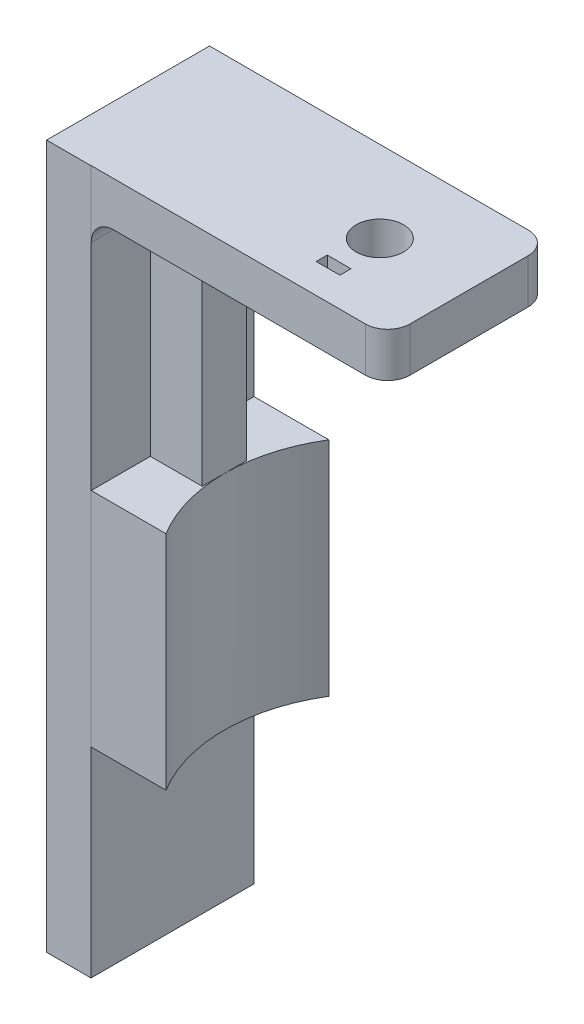
ISO-10303-21;
HEADER;
FILE_DESCRIPTION(('STEP AP214'),'2;1');
FILE_NAME('part.step','',(''),(''),'','','');
FILE_SCHEMA(('AUTOMOTIVE_DESIGN { 1 0 10303 214 1 1 1 1 }'));
ENDSEC;
DATA;
#1=APPLICATION_CONTEXT('core data for automotive mechanical design processes');
#2=APPLICATION_PROTOCOL_DEFINITION('international standard','automotive_design',2000,#1);
#3=PRODUCT_CONTEXT('',#1,'mechanical');
#4=PRODUCT('Part','Part','',(#3));
#5=PRODUCT_RELATED_PRODUCT_CATEGORY('part','',(#4));
#6=PRODUCT_DEFINITION_FORMATION('','',#4);
#7=PRODUCT_DEFINITION_CONTEXT('part definition',#1,'design');
#8=PRODUCT_DEFINITION('design','',#6,#7);
#9=PRODUCT_DEFINITION_SHAPE('','',#8);
#10=(LENGTH_UNIT() NAMED_UNIT(*) SI_UNIT(.MILLI.,.METRE.));
#11=(NAMED_UNIT(*) PLANE_ANGLE_UNIT() SI_UNIT($,.RADIAN.));
#12=(NAMED_UNIT(*) SI_UNIT($,.STERADIAN.) SOLID_ANGLE_UNIT());
#13=UNCERTAINTY_MEASURE_WITH_UNIT(LENGTH_MEASURE(1.E-05),#10,'distance_accuracy_value','');
#14=(GEOMETRIC_REPRESENTATION_CONTEXT(3) GLOBAL_UNCERTAINTY_ASSIGNED_CONTEXT((#13)) GLOBAL_UNIT_ASSIGNED_CONTEXT((#10,
#11,#12)) REPRESENTATION_CONTEXT('',''));
#15=CARTESIAN_POINT('',(0.,0.,0.));
#16=DIRECTION('',(0.,0.,1.));
#17=DIRECTION('',(1.,0.,0.));
#18=AXIS2_PLACEMENT_3D('',#15,#16,#17);
#19=CARTESIAN_POINT('',(-28.,95.,0.));
#20=DIRECTION('',(1.,0.,0.));
#21=DIRECTION('',(0.,0.,-1.));
#22=AXIS2_PLACEMENT_3D('',#19,#20,#21);
#23=PLANE('',#22);
#24=DIRECTION('',(0.,-1.,0.));
#25=VECTOR('',#24,1.);
#26=CARTESIAN_POINT('',(-28.,95.,-11.));
#27=LINE('',#26,#25);
#28=CARTESIAN_POINT('',(-28.,86.,-11.));
#29=VERTEX_POINT('',#28);
#30=CARTESIAN_POINT('',(-28.,57.,-11.));
#31=VERTEX_POINT('',#30);
#32=EDGE_CURVE('E224',#29,#31,#27,.T.);
#33=ORIENTED_EDGE('',*,*,#32,.F.);
#34=DIRECTION('',(0.,0.,1.));
#35=VECTOR('',#34,1.);
#36=CARTESIAN_POINT('',(-28.,86.,-3.01081498479428));
#37=LINE('',#36,#35);
#38=CARTESIAN_POINT('',(-28.,86.,-3.01081498479427));
#39=VERTEX_POINT('',#38);
#40=EDGE_CURVE('E384',#29,#39,#37,.T.);
#41=ORIENTED_EDGE('',*,*,#40,.T.);
#42=DIRECTION('',(0.,1.,0.));
#43=VECTOR('',#42,1.);
#44=CARTESIAN_POINT('',(-28.,89.,-3.01081498479427));
#45=LINE('',#44,#43);
#46=CARTESIAN_POINT('',(-28.,57.,-3.01081498479427));
#47=VERTEX_POINT('',#46);
#48=EDGE_CURVE('E253',#47,#39,#45,.T.);
#49=ORIENTED_EDGE('',*,*,#48,.F.);
#50=DIRECTION('',(0.,0.,-1.));
#51=VECTOR('',#50,1.);
#52=CARTESIAN_POINT('',(-28.,57.,10.9783700304121));
#53=LINE('',#52,#51);
#54=EDGE_CURVE('E229',#47,#31,#53,.T.);
#55=ORIENTED_EDGE('',*,*,#54,.T.);
#56=EDGE_LOOP('',(#33,#41,#49,#55));
#57=FACE_BOUND('',#56,.T.);
#58=ADVANCED_FACE('F35',(#57),#23,.T.);
#59=DIRECTION('',(0.,-1.,0.));
#60=VECTOR('',#59,1.);
#61=CARTESIAN_POINT('',(-28.,89.,2.98918501520605));
#62=LINE('',#61,#60);
#63=CARTESIAN_POINT('',(-28.,86.,2.98918501520605));
#64=VERTEX_POINT('',#63);
#65=CARTESIAN_POINT('',(-28.,57.,2.98918501520605));
#66=VERTEX_POINT('',#65);
#67=EDGE_CURVE('E249',#64,#66,#62,.T.);
#68=ORIENTED_EDGE('',*,*,#67,.F.);
#69=DIRECTION('',(0.,0.,1.));
#70=VECTOR('',#69,1.);
#71=CARTESIAN_POINT('',(-28.,86.,10.9783700304121));
#72=LINE('',#71,#70);
#73=CARTESIAN_POINT('',(-28.,86.,10.9783700304121));
#74=VERTEX_POINT('',#73);
#75=EDGE_CURVE('E372',#64,#74,#72,.T.);
#76=ORIENTED_EDGE('',*,*,#75,.T.);
#77=DIRECTION('',(0.,1.,0.));
#78=VECTOR('',#77,1.);
#79=CARTESIAN_POINT('',(-28.,89.,10.9783700304121));
#80=LINE('',#79,#78);
#81=CARTESIAN_POINT('',(-28.,95.,10.9783700304121));
#82=VERTEX_POINT('',#81);
#83=EDGE_CURVE('E319',#74,#82,#80,.T.);
#84=ORIENTED_EDGE('',*,*,#83,.T.);
#85=DIRECTION('',(0.,0.,1.));
#86=VECTOR('',#85,1.);
#87=CARTESIAN_POINT('',(-28.,95.,0.));
#88=LINE('',#87,#86);
#89=CARTESIAN_POINT('',(-28.,95.,11.));
#90=VERTEX_POINT('',#89);
#91=EDGE_CURVE('E342',#82,#90,#88,.T.);
#92=ORIENTED_EDGE('',*,*,#91,.T.);
#93=DIRECTION('',(0.,-1.,0.));
#94=VECTOR('',#93,1.);
#95=CARTESIAN_POINT('',(-28.,95.,11.));
#96=LINE('',#95,#94);
#97=CARTESIAN_POINT('',(-28.,0.,11.));
#98=VERTEX_POINT('',#97);
#99=EDGE_CURVE('E352',#90,#98,#96,.T.);
#100=ORIENTED_EDGE('',*,*,#99,.T.);
#101=DIRECTION('',(0.,0.,1.));
#102=VECTOR('',#101,1.);
#103=CARTESIAN_POINT('',(-28.,0.,0.));
#104=LINE('',#103,#102);
#105=CARTESIAN_POINT('',(-28.,0.,-11.));
#106=VERTEX_POINT('',#105);
#107=EDGE_CURVE('E333',#106,#98,#104,.T.);
#108=ORIENTED_EDGE('',*,*,#107,.F.);
#109=CARTESIAN_POINT('',(-28.,27.,-11.));
#110=VERTEX_POINT('',#109);
#111=EDGE_CURVE('E368',#110,#106,#27,.T.);
#112=ORIENTED_EDGE('',*,*,#111,.F.);
#113=DIRECTION('',(0.,0.,-1.));
#114=VECTOR('',#113,1.);
#115=CARTESIAN_POINT('',(-28.,27.,2.98918501520605));
#116=LINE('',#115,#114);
#117=CARTESIAN_POINT('',(-28.,27.,10.9783700304121));
#118=VERTEX_POINT('',#117);
#119=EDGE_CURVE('E257',#118,#110,#116,.T.);
#120=ORIENTED_EDGE('',*,*,#119,.F.);
#121=DIRECTION('',(0.,-1.,0.));
#122=VECTOR('',#121,1.);
#123=CARTESIAN_POINT('',(-28.,57.,10.9783700304121));
#124=LINE('',#123,#122);
#125=CARTESIAN_POINT('',(-28.,57.,10.9783700304121));
#126=VERTEX_POINT('',#125);
#127=EDGE_CURVE('E240',#126,#118,#124,.T.);
#128=ORIENTED_EDGE('',*,*,#127,.F.);
#129=EDGE_CURVE('E226',#126,#66,#53,.T.);
#130=ORIENTED_EDGE('',*,*,#129,.T.);
#131=EDGE_LOOP('',(#68,#76,#84,#92,#100,#108,#112,#120,#128,#130));
#132=FACE_BOUND('',#131,.T.);
#133=ADVANCED_FACE('F415',(#132),#23,.T.);
#134=CARTESIAN_POINT('',(-21.,89.,2.98918501520605));
#135=DIRECTION('',(0.,0.,-1.));
#136=DIRECTION('',(-1.,0.,0.));
#137=AXIS2_PLACEMENT_3D('',#134,#135,#136);
#138=PLANE('',#137);
#139=DIRECTION('',(-1.,0.,0.));
#140=VECTOR('',#139,1.);
#141=CARTESIAN_POINT('',(-21.,89.,2.98918501520605));
#142=LINE('',#141,#140);
#143=CARTESIAN_POINT('',(-18.,89.,2.98918501520605));
#144=VERTEX_POINT('',#143);
#145=CARTESIAN_POINT('',(-25.,89.,2.98918501520605));
#146=VERTEX_POINT('',#145);
#147=EDGE_CURVE('E255',#144,#146,#142,.T.);
#148=ORIENTED_EDGE('',*,*,#147,.T.);
#149=CARTESIAN_POINT('',(-25.,86.,2.98918501520605));
#150=DIRECTION('',(0.,0.,-1.));
#151=DIRECTION('',(-1.,0.,0.));
#152=AXIS2_PLACEMENT_3D('',#149,#150,#151);
#153=CIRCLE('',#152,3.);
#154=EDGE_CURVE('E382',#146,#64,#153,.F.);
#155=ORIENTED_EDGE('',*,*,#154,.T.);
#156=ORIENTED_EDGE('',*,*,#67,.T.);
#157=DIRECTION('',(-1.,0.,0.));
#158=VECTOR('',#157,1.);
#159=CARTESIAN_POINT('',(-21.,57.,2.98918501520605));
#160=LINE('',#159,#158);
#161=CARTESIAN_POINT('',(-21.,57.,2.98918501520605));
#162=VERTEX_POINT('',#161);
#163=EDGE_CURVE('E246',#162,#66,#160,.T.);
#164=ORIENTED_EDGE('',*,*,#163,.F.);
#165=DIRECTION('',(0.,-1.,0.));
#166=VECTOR('',#165,1.);
#167=CARTESIAN_POINT('',(-21.,89.,2.98918501520605));
#168=LINE('',#167,#166);
#169=CARTESIAN_POINT('',(-21.,86.,2.98918501520605));
#170=VERTEX_POINT('',#169);
#171=EDGE_CURVE('E250',#170,#162,#168,.T.);
#172=ORIENTED_EDGE('',*,*,#171,.F.);
#173=CARTESIAN_POINT('',(-18.,86.,2.98918501520605));
#174=DIRECTION('',(0.,0.,-1.));
#175=DIRECTION('',(-1.,0.,0.));
#176=AXIS2_PLACEMENT_3D('',#173,#174,#175);
#177=CIRCLE('',#176,3.);
#178=EDGE_CURVE('E43',#170,#144,#177,.T.);
#179=ORIENTED_EDGE('',*,*,#178,.T.);
#180=EDGE_LOOP('',(#148,#155,#156,#164,#172,#179));
#181=FACE_BOUND('',#180,.T.);
#182=ADVANCED_FACE('F398',(#181),#138,.F.);
#183=CARTESIAN_POINT('',(-21.,89.,-3.01081498479427));
#184=DIRECTION('',(0.,0.,1.));
#185=DIRECTION('',(1.,0.,0.));
#186=AXIS2_PLACEMENT_3D('',#183,#184,#185);
#187=PLANE('',#186);
#188=ORIENTED_EDGE('',*,*,#48,.T.);
#189=CARTESIAN_POINT('',(-25.,86.,-3.01081498479427));
#190=DIRECTION('',(0.,0.,1.));
#191=DIRECTION('',(1.,0.,0.));
#192=AXIS2_PLACEMENT_3D('',#189,#190,#191);
#193=CIRCLE('',#192,3.);
#194=CARTESIAN_POINT('',(-25.,89.,-3.01081498479427));
#195=VERTEX_POINT('',#194);
#196=EDGE_CURVE('E387',#39,#195,#193,.F.);
#197=ORIENTED_EDGE('',*,*,#196,.T.);
#198=DIRECTION('',(-1.,0.,0.));
#199=VECTOR('',#198,1.);
#200=CARTESIAN_POINT('',(-21.,89.,-3.01081498479427));
#201=LINE('',#200,#199);
#202=CARTESIAN_POINT('',(-18.,89.,-3.01081498479427));
#203=VERTEX_POINT('',#202);
#204=EDGE_CURVE('E263',#203,#195,#201,.T.);
#205=ORIENTED_EDGE('',*,*,#204,.F.);
#206=CARTESIAN_POINT('',(-18.,86.,-3.01081498479427));
#207=DIRECTION('',(0.,0.,1.));
#208=DIRECTION('',(1.,0.,0.));
#209=AXIS2_PLACEMENT_3D('',#206,#207,#208);
#210=CIRCLE('',#209,3.);
#211=CARTESIAN_POINT('',(-21.,86.,-3.01081498479427));
#212=VERTEX_POINT('',#211);
#213=EDGE_CURVE('E11',#203,#212,#210,.T.);
#214=ORIENTED_EDGE('',*,*,#213,.T.);
#215=DIRECTION('',(0.,1.,0.));
#216=VECTOR('',#215,1.);
#217=CARTESIAN_POINT('',(-21.,89.,-3.01081498479427));
#218=LINE('',#217,#216);
#219=CARTESIAN_POINT('',(-21.,57.,-3.01081498479427));
#220=VERTEX_POINT('',#219);
#221=EDGE_CURVE('E252',#220,#212,#218,.T.);
#222=ORIENTED_EDGE('',*,*,#221,.F.);
#223=DIRECTION('',(1.,0.,0.));
#224=VECTOR('',#223,1.);
#225=CARTESIAN_POINT('',(-21.,57.,-3.01081498479427));
#226=LINE('',#225,#224);
#227=EDGE_CURVE('E243',#47,#220,#226,.T.);
#228=ORIENTED_EDGE('',*,*,#227,.F.);
#229=EDGE_LOOP('',(#188,#197,#205,#214,#222,#228));
#230=FACE_BOUND('',#229,.T.);
#231=ADVANCED_FACE('F423',(#230),#187,.F.);
#232=CARTESIAN_POINT('',(-21.,0.,0.));
#233=DIRECTION('',(1.,0.,0.));
#234=DIRECTION('',(0.,0.,-1.));
#235=AXIS2_PLACEMENT_3D('',#232,#233,#234);
#236=PLANE('',#235);
#237=ORIENTED_EDGE('',*,*,#221,.T.);
#238=DIRECTION('',(0.,0.,1.));
#239=VECTOR('',#238,1.);
#240=CARTESIAN_POINT('',(-21.,86.,2.98918501520605));
#241=LINE('',#240,#239);
#242=EDGE_CURVE('E389',#212,#170,#241,.T.);
#243=ORIENTED_EDGE('',*,*,#242,.T.);
#244=ORIENTED_EDGE('',*,*,#171,.T.);
#245=DIRECTION('',(0.,0.,-1.));
#246=VECTOR('',#245,1.);
#247=CARTESIAN_POINT('',(-21.,57.,0.));
#248=LINE('',#247,#246);
#249=CARTESIAN_POINT('',(-21.,57.,0.));
#250=VERTEX_POINT('',#249);
#251=EDGE_CURVE('E371',#162,#250,#248,.T.);
#252=ORIENTED_EDGE('',*,*,#251,.T.);
#253=EDGE_CURVE('E218',#250,#220,#248,.T.);
#254=ORIENTED_EDGE('',*,*,#253,.T.);
#255=EDGE_LOOP('',(#237,#243,#244,#252,#254));
#256=FACE_BOUND('',#255,.T.);
#257=ADVANCED_FACE('F422',(#256),#236,.T.);
#258=CARTESIAN_POINT('',(9.04131752396575,89.,7.97837003041212));
#259=DIRECTION('',(0.,-1.,0.));
#260=DIRECTION('',(0.,0.,-1.));
#261=AXIS2_PLACEMENT_3D('',#258,#259,#260);
#262=PLANE('',#261);
#263=DIRECTION('',(0.,0.,1.));
#264=VECTOR('',#263,1.);
#265=CARTESIAN_POINT('',(-1.6,89.,5.5));
#266=LINE('',#265,#264);
#267=CARTESIAN_POINT('',(-1.6,89.,5.5));
#268=VERTEX_POINT('',#267);
#269=CARTESIAN_POINT('',(-1.6,89.,7.));
#270=VERTEX_POINT('',#269);
#271=EDGE_CURVE('E267',#268,#270,#266,.T.);
#272=ORIENTED_EDGE('',*,*,#271,.T.);
#273=DIRECTION('',(1.,0.,0.));
#274=VECTOR('',#273,1.);
#275=CARTESIAN_POINT('',(-1.6,89.,7.));
#276=LINE('',#275,#274);
#277=CARTESIAN_POINT('',(1.6,89.,7.));
#278=VERTEX_POINT('',#277);
#279=EDGE_CURVE('E270',#270,#278,#276,.T.);
#280=ORIENTED_EDGE('',*,*,#279,.T.);
#281=DIRECTION('',(0.,0.,-1.));
#282=VECTOR('',#281,1.);
#283=CARTESIAN_POINT('',(1.6,89.,5.5));
#284=LINE('',#283,#282);
#285=CARTESIAN_POINT('',(1.6,89.,5.5));
#286=VERTEX_POINT('',#285);
#287=EDGE_CURVE('E274',#278,#286,#284,.T.);
#288=ORIENTED_EDGE('',*,*,#287,.T.);
#289=DIRECTION('',(-1.,0.,0.));
#290=VECTOR('',#289,1.);
#291=CARTESIAN_POINT('',(-1.6,89.,5.5));
#292=LINE('',#291,#290);
#293=EDGE_CURVE('E277',#286,#268,#292,.T.);
#294=ORIENTED_EDGE('',*,*,#293,.T.);
#295=EDGE_LOOP('',(#272,#280,#288,#294));
#296=FACE_BOUND('',#295,.T.);
#297=CARTESIAN_POINT('',(0.,89.,0.));
#298=DIRECTION('',(0.,1.,0.));
#299=DIRECTION('',(0.,0.,1.));
#300=AXIS2_PLACEMENT_3D('',#297,#298,#299);
#301=CIRCLE('',#300,3.2);
#302=CARTESIAN_POINT('',(0.,89.,3.2));
#303=VERTEX_POINT('',#302);
#304=EDGE_CURVE('E299',#303,#303,#301,.T.);
#305=ORIENTED_EDGE('',*,*,#304,.T.);
#306=EDGE_LOOP('',(#305));
#307=FACE_BOUND('',#306,.T.);
#308=DIRECTION('',(1.,0.,0.));
#309=VECTOR('',#308,1.);
#310=CARTESIAN_POINT('',(-28.,89.,10.9783700304121));
#311=LINE('',#310,#309);
#312=CARTESIAN_POINT('',(-25.,89.,10.9783700304121));
#313=VERTEX_POINT('',#312);
#314=CARTESIAN_POINT('',(9.04131752396575,89.,10.9783700304121));
#315=VERTEX_POINT('',#314);
#316=EDGE_CURVE('E305',#313,#315,#311,.T.);
#317=ORIENTED_EDGE('',*,*,#316,.F.);
#318=DIRECTION('',(0.,0.,1.));
#319=VECTOR('',#318,1.);
#320=CARTESIAN_POINT('',(-25.,89.,2.98918501520605));
#321=LINE('',#320,#319);
#322=EDGE_CURVE('E380',#313,#146,#321,.F.);
#323=ORIENTED_EDGE('',*,*,#322,.T.);
#324=ORIENTED_EDGE('',*,*,#147,.F.);
#325=DIRECTION('',(0.,0.,1.));
#326=VECTOR('',#325,1.);
#327=CARTESIAN_POINT('',(-18.,89.,-3.01081498479428));
#328=LINE('',#327,#326);
#329=EDGE_CURVE('E375',#144,#203,#328,.F.);
#330=ORIENTED_EDGE('',*,*,#329,.T.);
#331=ORIENTED_EDGE('',*,*,#204,.T.);
#332=DIRECTION('',(0.,0.,1.));
#333=VECTOR('',#332,1.);
#334=CARTESIAN_POINT('',(-25.,89.,-11.));
#335=LINE('',#334,#333);
#336=CARTESIAN_POINT('',(-25.,89.,-11.));
#337=VERTEX_POINT('',#336);
#338=EDGE_CURVE('E378',#195,#337,#335,.F.);
#339=ORIENTED_EDGE('',*,*,#338,.T.);
#340=DIRECTION('',(-1.,0.,0.));
#341=VECTOR('',#340,1.);
#342=CARTESIAN_POINT('',(-28.,89.,-11.));
#343=LINE('',#342,#341);
#344=CARTESIAN_POINT('',(9.04131752396575,89.,-11.));
#345=VERTEX_POINT('',#344);
#346=EDGE_CURVE('E317',#345,#337,#343,.T.);
#347=ORIENTED_EDGE('',*,*,#346,.F.);
#348=CARTESIAN_POINT('',(9.04131752396575,89.,-8.));
#349=DIRECTION('',(0.,1.,0.));
#350=DIRECTION('',(0.,0.,1.));
#351=AXIS2_PLACEMENT_3D('',#348,#349,#350);
#352=CIRCLE('',#351,3.);
#353=CARTESIAN_POINT('',(12.0413175239657,89.,-8.));
#354=VERTEX_POINT('',#353);
#355=EDGE_CURVE('E314',#354,#345,#352,.T.);
#356=ORIENTED_EDGE('',*,*,#355,.F.);
#357=DIRECTION('',(0.,0.,-1.));
#358=VECTOR('',#357,1.);
#359=CARTESIAN_POINT('',(12.0413175239657,89.,-8.));
#360=LINE('',#359,#358);
#361=CARTESIAN_POINT('',(12.0413175239657,89.,7.97837003041212));
#362=VERTEX_POINT('',#361);
#363=EDGE_CURVE('E311',#362,#354,#360,.T.);
#364=ORIENTED_EDGE('',*,*,#363,.F.);
#365=CARTESIAN_POINT('',(9.04131752396575,89.,7.97837003041212));
#366=DIRECTION('',(0.,1.,0.));
#367=DIRECTION('',(0.,0.,-1.));
#368=AXIS2_PLACEMENT_3D('',#365,#366,#367);
#369=CIRCLE('',#368,3.);
#370=EDGE_CURVE('E307',#315,#362,#369,.T.);
#371=ORIENTED_EDGE('',*,*,#370,.F.);
#372=EDGE_LOOP('',(#317,#323,#324,#330,#331,#339,#347,#356,#364,#371));
#373=FACE_BOUND('',#372,.T.);
#374=ADVANCED_FACE('F405',(#296,#307,#373),#262,.T.);
#375=CARTESIAN_POINT('',(0.,95.,-11.));
#376=DIRECTION('',(0.,0.,-1.));
#377=DIRECTION('',(-1.,0.,0.));
#378=AXIS2_PLACEMENT_3D('',#375,#376,#377);
#379=PLANE('',#378);
#380=DIRECTION('',(1.,0.,0.));
#381=VECTOR('',#380,1.);
#382=CARTESIAN_POINT('',(0.,0.,-11.));
#383=LINE('',#382,#381);
#384=CARTESIAN_POINT('',(-34.,0.,-11.));
#385=VERTEX_POINT('',#384);
#386=EDGE_CURVE('E355',#385,#106,#383,.T.);
#387=ORIENTED_EDGE('',*,*,#386,.F.);
#388=DIRECTION('',(0.,-1.,0.));
#389=VECTOR('',#388,1.);
#390=CARTESIAN_POINT('',(-34.,95.,-11.));
#391=LINE('',#390,#389);
#392=CARTESIAN_POINT('',(-34.,95.,-11.));
#393=VERTEX_POINT('',#392);
#394=EDGE_CURVE('E366',#393,#385,#391,.T.);
#395=ORIENTED_EDGE('',*,*,#394,.F.);
#396=DIRECTION('',(1.,0.,0.));
#397=VECTOR('',#396,1.);
#398=CARTESIAN_POINT('',(0.,95.,-11.));
#399=LINE('',#398,#397);
#400=CARTESIAN_POINT('',(9.04131752396575,95.,-11.));
#401=VERTEX_POINT('',#400);
#402=EDGE_CURVE('E344',#393,#401,#399,.T.);
#403=ORIENTED_EDGE('',*,*,#402,.T.);
#404=DIRECTION('',(0.,1.,0.));
#405=VECTOR('',#404,1.);
#406=CARTESIAN_POINT('',(9.04131752396575,89.,-11.));
#407=LINE('',#406,#405);
#408=EDGE_CURVE('E330',#345,#401,#407,.T.);
#409=ORIENTED_EDGE('',*,*,#408,.F.);
#410=ORIENTED_EDGE('',*,*,#346,.T.);
#411=CARTESIAN_POINT('',(-25.,86.,-11.));
#412=DIRECTION('',(0.,0.,-1.));
#413=DIRECTION('',(-1.,0.,0.));
#414=AXIS2_PLACEMENT_3D('',#411,#412,#413);
#415=CIRCLE('',#414,3.);
#416=EDGE_CURVE('E56',#337,#29,#415,.F.);
#417=ORIENTED_EDGE('',*,*,#416,.T.);
#418=ORIENTED_EDGE('',*,*,#32,.T.);
#419=DIRECTION('',(1.,0.,0.));
#420=VECTOR('',#419,1.);
#421=CARTESIAN_POINT('',(-28.,57.,-11.));
#422=LINE('',#421,#420);
#423=CARTESIAN_POINT('',(-17.8885438199983,57.,-11.));
#424=VERTEX_POINT('',#423);
#425=EDGE_CURVE('E216',#31,#424,#422,.T.);
#426=ORIENTED_EDGE('',*,*,#425,.T.);
#427=DIRECTION('',(0.,-1.,0.));
#428=VECTOR('',#427,1.);
#429=CARTESIAN_POINT('',(-17.8885438199983,57.,-11.));
#430=LINE('',#429,#428);
#431=CARTESIAN_POINT('',(-17.8885438199983,27.,-11.));
#432=VERTEX_POINT('',#431);
#433=EDGE_CURVE('E199',#424,#432,#430,.T.);
#434=ORIENTED_EDGE('',*,*,#433,.T.);
#435=DIRECTION('',(1.,0.,0.));
#436=VECTOR('',#435,1.);
#437=CARTESIAN_POINT('',(-28.,27.,-11.));
#438=LINE('',#437,#436);
#439=EDGE_CURVE('E234',#110,#432,#438,.T.);
#440=ORIENTED_EDGE('',*,*,#439,.F.);
#441=ORIENTED_EDGE('',*,*,#111,.T.);
#442=EDGE_LOOP('',(#387,#395,#403,#409,#410,#417,#418,#426,#434,#440,#441));
#443=FACE_BOUND('',#442,.T.);
#444=ADVANCED_FACE('F223',(#443),#379,.T.);
#445=CARTESIAN_POINT('',(-34.,95.,0.));
#446=DIRECTION('',(1.,0.,0.));
#447=DIRECTION('',(0.,0.,-1.));
#448=AXIS2_PLACEMENT_3D('',#445,#446,#447);
#449=PLANE('',#448);
#450=DIRECTION('',(0.,0.,1.));
#451=VECTOR('',#450,1.);
#452=CARTESIAN_POINT('',(-34.,0.,0.));
#453=LINE('',#452,#451);
#454=CARTESIAN_POINT('',(-34.,0.,11.));
#455=VERTEX_POINT('',#454);
#456=EDGE_CURVE('E358',#385,#455,#453,.T.);
#457=ORIENTED_EDGE('',*,*,#456,.T.);
#458=DIRECTION('',(0.,-1.,0.));
#459=VECTOR('',#458,1.);
#460=CARTESIAN_POINT('',(-34.,95.,11.));
#461=LINE('',#460,#459);
#462=CARTESIAN_POINT('',(-34.,95.,11.));
#463=VERTEX_POINT('',#462);
#464=EDGE_CURVE('E363',#463,#455,#461,.T.);
#465=ORIENTED_EDGE('',*,*,#464,.F.);
#466=DIRECTION('',(0.,0.,1.));
#467=VECTOR('',#466,1.);
#468=CARTESIAN_POINT('',(-34.,95.,0.));
#469=LINE('',#468,#467);
#470=EDGE_CURVE('E347',#393,#463,#469,.T.);
#471=ORIENTED_EDGE('',*,*,#470,.F.);
#472=ORIENTED_EDGE('',*,*,#394,.T.);
#473=EDGE_LOOP('',(#457,#465,#471,#472));
#474=FACE_BOUND('',#473,.T.);
#475=ADVANCED_FACE('F522',(#474),#449,.F.);
#476=CARTESIAN_POINT('',(0.,95.,11.));
#477=DIRECTION('',(0.,0.,-1.));
#478=DIRECTION('',(-1.,0.,0.));
#479=AXIS2_PLACEMENT_3D('',#476,#477,#478);
#480=PLANE('',#479);
#481=DIRECTION('',(1.,0.,0.));
#482=VECTOR('',#481,1.);
#483=CARTESIAN_POINT('',(0.,0.,11.));
#484=LINE('',#483,#482);
#485=EDGE_CURVE('E345',#455,#98,#484,.T.);
#486=ORIENTED_EDGE('',*,*,#485,.T.);
#487=ORIENTED_EDGE('',*,*,#99,.F.);
#488=DIRECTION('',(1.,0.,0.));
#489=VECTOR('',#488,1.);
#490=CARTESIAN_POINT('',(0.,95.,11.));
#491=LINE('',#490,#489);
#492=EDGE_CURVE('E349',#463,#90,#491,.T.);
#493=ORIENTED_EDGE('',*,*,#492,.F.);
#494=ORIENTED_EDGE('',*,*,#464,.T.);
#495=EDGE_LOOP('',(#486,#487,#493,#494));
#496=FACE_BOUND('',#495,.T.);
#497=ADVANCED_FACE('F454',(#496),#480,.F.);
#498=CARTESIAN_POINT('',(0.,95.,0.));
#499=DIRECTION('',(0.,1.,0.));
#500=DIRECTION('',(0.,0.,1.));
#501=AXIS2_PLACEMENT_3D('',#498,#499,#500);
#502=PLANE('',#501);
#503=ORIENTED_EDGE('',*,*,#91,.F.);
#504=DIRECTION('',(1.,0.,0.));
#505=VECTOR('',#504,1.);
#506=CARTESIAN_POINT('',(-28.,95.,10.9783700304121));
#507=LINE('',#506,#505);
#508=CARTESIAN_POINT('',(9.04131752396575,95.,10.9783700304121));
#509=VERTEX_POINT('',#508);
#510=EDGE_CURVE('E302',#82,#509,#507,.T.);
#511=ORIENTED_EDGE('',*,*,#510,.T.);
#512=CARTESIAN_POINT('',(9.04131752396575,95.,7.97837003041212));
#513=DIRECTION('',(0.,1.,0.));
#514=DIRECTION('',(0.,0.,-1.));
#515=AXIS2_PLACEMENT_3D('',#512,#513,#514);
#516=CIRCLE('',#515,3.);
#517=CARTESIAN_POINT('',(12.0413175239657,95.,7.97837003041212));
#518=VERTEX_POINT('',#517);
#519=EDGE_CURVE('E322',#509,#518,#516,.T.);
#520=ORIENTED_EDGE('',*,*,#519,.T.);
#521=DIRECTION('',(0.,0.,-1.));
#522=VECTOR('',#521,1.);
#523=CARTESIAN_POINT('',(12.0413175239657,95.,-8.));
#524=LINE('',#523,#522);
#525=CARTESIAN_POINT('',(12.0413175239657,95.,-8.));
#526=VERTEX_POINT('',#525);
#527=EDGE_CURVE('E325',#518,#526,#524,.T.);
#528=ORIENTED_EDGE('',*,*,#527,.T.);
#529=CARTESIAN_POINT('',(9.04131752396575,95.,-8.));
#530=DIRECTION('',(0.,1.,0.));
#531=DIRECTION('',(0.,0.,1.));
#532=AXIS2_PLACEMENT_3D('',#529,#530,#531);
#533=CIRCLE('',#532,3.);
#534=EDGE_CURVE('E308',#526,#401,#533,.T.);
#535=ORIENTED_EDGE('',*,*,#534,.T.);
#536=ORIENTED_EDGE('',*,*,#402,.F.);
#537=ORIENTED_EDGE('',*,*,#470,.T.);
#538=ORIENTED_EDGE('',*,*,#492,.T.);
#539=EDGE_LOOP('',(#503,#511,#520,#528,#535,#536,#537,#538));
#540=FACE_BOUND('',#539,.T.);
#541=DIRECTION('',(1.,0.,0.));
#542=VECTOR('',#541,1.);
#543=CARTESIAN_POINT('',(-1.6,95.,7.));
#544=LINE('',#543,#542);
#545=CARTESIAN_POINT('',(-1.6,95.,7.));
#546=VERTEX_POINT('',#545);
#547=CARTESIAN_POINT('',(1.6,95.,7.));
#548=VERTEX_POINT('',#547);
#549=EDGE_CURVE('E282',#546,#548,#544,.T.);
#550=ORIENTED_EDGE('',*,*,#549,.F.);
#551=DIRECTION('',(0.,0.,1.));
#552=VECTOR('',#551,1.);
#553=CARTESIAN_POINT('',(-1.6,95.,5.5));
#554=LINE('',#553,#552);
#555=CARTESIAN_POINT('',(-1.6,95.,5.5));
#556=VERTEX_POINT('',#555);
#557=EDGE_CURVE('E266',#556,#546,#554,.T.);
#558=ORIENTED_EDGE('',*,*,#557,.F.);
#559=DIRECTION('',(-1.,0.,0.));
#560=VECTOR('',#559,1.);
#561=CARTESIAN_POINT('',(-1.6,95.,5.5));
#562=LINE('',#561,#560);
#563=CARTESIAN_POINT('',(1.6,95.,5.5));
#564=VERTEX_POINT('',#563);
#565=EDGE_CURVE('E271',#564,#556,#562,.T.);
#566=ORIENTED_EDGE('',*,*,#565,.F.);
#567=DIRECTION('',(0.,0.,-1.));
#568=VECTOR('',#567,1.);
#569=CARTESIAN_POINT('',(1.6,95.,5.5));
#570=LINE('',#569,#568);
#571=EDGE_CURVE('E285',#548,#564,#570,.T.);
#572=ORIENTED_EDGE('',*,*,#571,.F.);
#573=EDGE_LOOP('',(#550,#558,#566,#572));
#574=FACE_BOUND('',#573,.T.);
#575=CARTESIAN_POINT('',(0.,95.,0.));
#576=DIRECTION('',(0.,1.,0.));
#577=DIRECTION('',(0.,0.,1.));
#578=AXIS2_PLACEMENT_3D('',#575,#576,#577);
#579=CIRCLE('',#578,3.2);
#580=CARTESIAN_POINT('',(0.,95.,3.2));
#581=VERTEX_POINT('',#580);
#582=EDGE_CURVE('E292',#581,#581,#579,.T.);
#583=ORIENTED_EDGE('',*,*,#582,.F.);
#584=EDGE_LOOP('',(#583));
#585=FACE_BOUND('',#584,.T.);
#586=ADVANCED_FACE('F447',(#540,#574,#585),#502,.T.);
#587=CARTESIAN_POINT('',(0.,0.,0.));
#588=DIRECTION('',(0.,1.,0.));
#589=DIRECTION('',(0.,0.,1.));
#590=AXIS2_PLACEMENT_3D('',#587,#588,#589);
#591=PLANE('',#590);
#592=ORIENTED_EDGE('',*,*,#107,.T.);
#593=ORIENTED_EDGE('',*,*,#485,.F.);
#594=ORIENTED_EDGE('',*,*,#456,.F.);
#595=ORIENTED_EDGE('',*,*,#386,.T.);
#596=EDGE_LOOP('',(#592,#593,#594,#595));
#597=FACE_BOUND('',#596,.T.);
#598=ADVANCED_FACE('F460',(#597),#591,.F.);
#599=CARTESIAN_POINT('',(9.04131752396575,89.,-8.));
#600=DIRECTION('',(0.,1.,0.));
#601=DIRECTION('',(0.,0.,1.));
#602=AXIS2_PLACEMENT_3D('',#599,#600,#601);
#603=CYLINDRICAL_SURFACE('',#602,3.);
#604=ORIENTED_EDGE('',*,*,#534,.F.);
#605=DIRECTION('',(0.,1.,0.));
#606=VECTOR('',#605,1.);
#607=CARTESIAN_POINT('',(12.0413175239657,89.,-8.));
#608=LINE('',#607,#606);
#609=EDGE_CURVE('E334',#354,#526,#608,.T.);
#610=ORIENTED_EDGE('',*,*,#609,.F.);
#611=ORIENTED_EDGE('',*,*,#355,.T.);
#612=ORIENTED_EDGE('',*,*,#408,.T.);
#613=EDGE_LOOP('',(#604,#610,#611,#612));
#614=FACE_BOUND('',#613,.T.);
#615=ADVANCED_FACE('F434',(#614),#603,.T.);
#616=CARTESIAN_POINT('',(12.0413175239657,89.,-8.));
#617=DIRECTION('',(1.,0.,0.));
#618=DIRECTION('',(0.,0.,-1.));
#619=AXIS2_PLACEMENT_3D('',#616,#617,#618);
#620=PLANE('',#619);
#621=ORIENTED_EDGE('',*,*,#527,.F.);
#622=DIRECTION('',(0.,1.,0.));
#623=VECTOR('',#622,1.);
#624=CARTESIAN_POINT('',(12.0413175239657,89.,7.97837003041212));
#625=LINE('',#624,#623);
#626=EDGE_CURVE('E336',#362,#518,#625,.T.);
#627=ORIENTED_EDGE('',*,*,#626,.F.);
#628=ORIENTED_EDGE('',*,*,#363,.T.);
#629=ORIENTED_EDGE('',*,*,#609,.T.);
#630=EDGE_LOOP('',(#621,#627,#628,#629));
#631=FACE_BOUND('',#630,.T.);
#632=ADVANCED_FACE('F438',(#631),#620,.T.);
#633=CARTESIAN_POINT('',(9.04131752396575,89.,7.97837003041212));
#634=DIRECTION('',(0.,1.,0.));
#635=DIRECTION('',(0.,0.,1.));
#636=AXIS2_PLACEMENT_3D('',#633,#634,#635);
#637=CYLINDRICAL_SURFACE('',#636,3.);
#638=ORIENTED_EDGE('',*,*,#519,.F.);
#639=DIRECTION('',(0.,1.,0.));
#640=VECTOR('',#639,1.);
#641=CARTESIAN_POINT('',(9.04131752396575,89.,10.9783700304121));
#642=LINE('',#641,#640);
#643=EDGE_CURVE('E338',#315,#509,#642,.T.);
#644=ORIENTED_EDGE('',*,*,#643,.F.);
#645=ORIENTED_EDGE('',*,*,#370,.T.);
#646=ORIENTED_EDGE('',*,*,#626,.T.);
#647=EDGE_LOOP('',(#638,#644,#645,#646));
#648=FACE_BOUND('',#647,.T.);
#649=ADVANCED_FACE('F441',(#648),#637,.T.);
#650=CARTESIAN_POINT('',(-28.,89.,10.9783700304121));
#651=DIRECTION('',(0.,0.,1.));
#652=DIRECTION('',(1.,0.,0.));
#653=AXIS2_PLACEMENT_3D('',#650,#651,#652);
#654=PLANE('',#653);
#655=ORIENTED_EDGE('',*,*,#510,.F.);
#656=ORIENTED_EDGE('',*,*,#83,.F.);
#657=CARTESIAN_POINT('',(-25.,86.,10.9783700304121));
#658=DIRECTION('',(0.,0.,1.));
#659=DIRECTION('',(1.,0.,0.));
#660=AXIS2_PLACEMENT_3D('',#657,#658,#659);
#661=CIRCLE('',#660,3.);
#662=EDGE_CURVE('E392',#74,#313,#661,.F.);
#663=ORIENTED_EDGE('',*,*,#662,.T.);
#664=ORIENTED_EDGE('',*,*,#316,.T.);
#665=ORIENTED_EDGE('',*,*,#643,.T.);
#666=EDGE_LOOP('',(#655,#656,#663,#664,#665));
#667=FACE_BOUND('',#666,.T.);
#668=ADVANCED_FACE('F444',(#667),#654,.T.);
#669=CARTESIAN_POINT('',(0.,89.,0.));
#670=DIRECTION('',(0.,1.,0.));
#671=DIRECTION('',(0.,0.,1.));
#672=AXIS2_PLACEMENT_3D('',#669,#670,#671);
#673=CYLINDRICAL_SURFACE('',#672,3.2);
#674=ORIENTED_EDGE('',*,*,#304,.F.);
#675=EDGE_LOOP('',(#674));
#676=FACE_BOUND('',#675,.T.);
#677=ORIENTED_EDGE('',*,*,#582,.T.);
#678=EDGE_LOOP('',(#677));
#679=FACE_BOUND('',#678,.T.);
#680=ADVANCED_FACE('F509',(#676,#679),#673,.F.);
#681=CARTESIAN_POINT('',(-1.6,89.,5.5));
#682=DIRECTION('',(-1.,0.,0.));
#683=DIRECTION('',(0.,0.,1.));
#684=AXIS2_PLACEMENT_3D('',#681,#682,#683);
#685=PLANE('',#684);
#686=ORIENTED_EDGE('',*,*,#557,.T.);
#687=DIRECTION('',(0.,1.,0.));
#688=VECTOR('',#687,1.);
#689=CARTESIAN_POINT('',(-1.6,89.,7.));
#690=LINE('',#689,#688);
#691=EDGE_CURVE('E280',#270,#546,#690,.T.);
#692=ORIENTED_EDGE('',*,*,#691,.F.);
#693=ORIENTED_EDGE('',*,*,#271,.F.);
#694=DIRECTION('',(0.,1.,0.));
#695=VECTOR('',#694,1.);
#696=CARTESIAN_POINT('',(-1.6,89.,5.5));
#697=LINE('',#696,#695);
#698=EDGE_CURVE('E290',#268,#556,#697,.T.);
#699=ORIENTED_EDGE('',*,*,#698,.T.);
#700=EDGE_LOOP('',(#686,#692,#693,#699));
#701=FACE_BOUND('',#700,.T.);
#702=ADVANCED_FACE('F628',(#701),#685,.F.);
#703=CARTESIAN_POINT('',(-1.6,89.,5.5));
#704=DIRECTION('',(0.,0.,-1.));
#705=DIRECTION('',(-1.,0.,0.));
#706=AXIS2_PLACEMENT_3D('',#703,#704,#705);
#707=PLANE('',#706);
#708=ORIENTED_EDGE('',*,*,#565,.T.);
#709=ORIENTED_EDGE('',*,*,#698,.F.);
#710=ORIENTED_EDGE('',*,*,#293,.F.);
#711=DIRECTION('',(0.,1.,0.));
#712=VECTOR('',#711,1.);
#713=CARTESIAN_POINT('',(1.6,89.,5.5));
#714=LINE('',#713,#712);
#715=EDGE_CURVE('E293',#286,#564,#714,.T.);
#716=ORIENTED_EDGE('',*,*,#715,.T.);
#717=EDGE_LOOP('',(#708,#709,#710,#716));
#718=FACE_BOUND('',#717,.T.);
#719=ADVANCED_FACE('F618',(#718),#707,.F.);
#720=CARTESIAN_POINT('',(1.6,89.,5.5));
#721=DIRECTION('',(1.,0.,0.));
#722=DIRECTION('',(0.,0.,-1.));
#723=AXIS2_PLACEMENT_3D('',#720,#721,#722);
#724=PLANE('',#723);
#725=ORIENTED_EDGE('',*,*,#571,.T.);
#726=ORIENTED_EDGE('',*,*,#715,.F.);
#727=ORIENTED_EDGE('',*,*,#287,.F.);
#728=DIRECTION('',(0.,1.,0.));
#729=VECTOR('',#728,1.);
#730=CARTESIAN_POINT('',(1.6,89.,7.));
#731=LINE('',#730,#729);
#732=EDGE_CURVE('E295',#278,#548,#731,.T.);
#733=ORIENTED_EDGE('',*,*,#732,.T.);
#734=EDGE_LOOP('',(#725,#726,#727,#733));
#735=FACE_BOUND('',#734,.T.);
#736=ADVANCED_FACE('F608',(#735),#724,.F.);
#737=CARTESIAN_POINT('',(-1.6,89.,7.));
#738=DIRECTION('',(0.,0.,1.));
#739=DIRECTION('',(1.,0.,0.));
#740=AXIS2_PLACEMENT_3D('',#737,#738,#739);
#741=PLANE('',#740);
#742=ORIENTED_EDGE('',*,*,#549,.T.);
#743=ORIENTED_EDGE('',*,*,#732,.F.);
#744=ORIENTED_EDGE('',*,*,#279,.F.);
#745=ORIENTED_EDGE('',*,*,#691,.T.);
#746=EDGE_LOOP('',(#742,#743,#744,#745));
#747=FACE_BOUND('',#746,.T.);
#748=ADVANCED_FACE('F600',(#747),#741,.F.);
#749=CARTESIAN_POINT('',(-21.,27.,2.98918501520605));
#750=DIRECTION('',(0.,1.,0.));
#751=DIRECTION('',(0.,0.,1.));
#752=AXIS2_PLACEMENT_3D('',#749,#750,#751);
#753=PLANE('',#752);
#754=DIRECTION('',(-1.,0.,0.));
#755=VECTOR('',#754,1.);
#756=CARTESIAN_POINT('',(-28.,27.,10.9783700304121));
#757=LINE('',#756,#755);
#758=CARTESIAN_POINT('',(-17.9018264843381,27.,10.9783700304121));
#759=VERTEX_POINT('',#758);
#760=EDGE_CURVE('E237',#759,#118,#757,.T.);
#761=ORIENTED_EDGE('',*,*,#760,.T.);
#762=ORIENTED_EDGE('',*,*,#119,.T.);
#763=ORIENTED_EDGE('',*,*,#439,.T.);
#764=CARTESIAN_POINT('',(0.,27.,0.));
#765=DIRECTION('',(0.,1.,0.));
#766=DIRECTION('',(0.,0.,-1.));
#767=AXIS2_PLACEMENT_3D('',#764,#765,#766);
#768=CIRCLE('',#767,21.);
#769=EDGE_CURVE('E204',#432,#759,#768,.T.);
#770=ORIENTED_EDGE('',*,*,#769,.T.);
#771=EDGE_LOOP('',(#761,#762,#763,#770));
#772=FACE_BOUND('',#771,.T.);
#773=ADVANCED_FACE('F462',(#772),#753,.F.);
#774=CARTESIAN_POINT('',(0.,57.,0.));
#775=DIRECTION('',(0.,-1.,0.));
#776=DIRECTION('',(0.,0.,-1.));
#777=AXIS2_PLACEMENT_3D('',#774,#775,#776);
#778=CYLINDRICAL_SURFACE('',#777,21.);
#779=CARTESIAN_POINT('',(0.,57.,0.));
#780=DIRECTION('',(0.,1.,0.));
#781=DIRECTION('',(0.,0.,-1.));
#782=AXIS2_PLACEMENT_3D('',#779,#780,#781);
#783=CIRCLE('',#782,21.);
#784=EDGE_CURVE('E202',#424,#250,#783,.T.);
#785=ORIENTED_EDGE('',*,*,#784,.T.);
#786=CARTESIAN_POINT('',(-17.9018264843381,57.,10.9783700304121));
#787=VERTEX_POINT('',#786);
#788=EDGE_CURVE('E220',#250,#787,#783,.T.);
#789=ORIENTED_EDGE('',*,*,#788,.T.);
#790=DIRECTION('',(0.,-1.,0.));
#791=VECTOR('',#790,1.);
#792=CARTESIAN_POINT('',(-17.9018264843381,57.,10.9783700304121));
#793=LINE('',#792,#791);
#794=EDGE_CURVE('E208',#787,#759,#793,.T.);
#795=ORIENTED_EDGE('',*,*,#794,.T.);
#796=ORIENTED_EDGE('',*,*,#769,.F.);
#797=ORIENTED_EDGE('',*,*,#433,.F.);
#798=EDGE_LOOP('',(#785,#789,#795,#796,#797));
#799=FACE_BOUND('',#798,.T.);
#800=ADVANCED_FACE('F201',(#799),#778,.F.);
#801=CARTESIAN_POINT('',(0.,57.,0.));
#802=DIRECTION('',(0.,-1.,0.));
#803=DIRECTION('',(0.,0.,-1.));
#804=AXIS2_PLACEMENT_3D('',#801,#802,#803);
#805=PLANE('',#804);
#806=ORIENTED_EDGE('',*,*,#251,.F.);
#807=ORIENTED_EDGE('',*,*,#163,.T.);
#808=ORIENTED_EDGE('',*,*,#129,.F.);
#809=DIRECTION('',(-1.,0.,0.));
#810=VECTOR('',#809,1.);
#811=CARTESIAN_POINT('',(-28.,57.,10.9783700304121));
#812=LINE('',#811,#810);
#813=EDGE_CURVE('E209',#787,#126,#812,.T.);
#814=ORIENTED_EDGE('',*,*,#813,.F.);
#815=ORIENTED_EDGE('',*,*,#788,.F.);
#816=EDGE_LOOP('',(#806,#807,#808,#814,#815));
#817=FACE_BOUND('',#816,.T.);
#818=ADVANCED_FACE('F420',(#817),#805,.F.);
#819=ORIENTED_EDGE('',*,*,#54,.F.);
#820=ORIENTED_EDGE('',*,*,#227,.T.);
#821=ORIENTED_EDGE('',*,*,#253,.F.);
#822=ORIENTED_EDGE('',*,*,#784,.F.);
#823=ORIENTED_EDGE('',*,*,#425,.F.);
#824=EDGE_LOOP('',(#819,#820,#821,#822,#823));
#825=FACE_BOUND('',#824,.T.);
#826=ADVANCED_FACE('F215',(#825),#805,.F.);
#827=CARTESIAN_POINT('',(-28.,57.,10.9783700304121));
#828=DIRECTION('',(0.,0.,1.));
#829=DIRECTION('',(1.,0.,0.));
#830=AXIS2_PLACEMENT_3D('',#827,#828,#829);
#831=PLANE('',#830);
#832=ORIENTED_EDGE('',*,*,#760,.F.);
#833=ORIENTED_EDGE('',*,*,#794,.F.);
#834=ORIENTED_EDGE('',*,*,#813,.T.);
#835=ORIENTED_EDGE('',*,*,#127,.T.);
#836=EDGE_LOOP('',(#832,#833,#834,#835));
#837=FACE_BOUND('',#836,.T.);
#838=ADVANCED_FACE('F465',(#837),#831,.T.);
#839=CARTESIAN_POINT('',(-25.,86.,0.));
#840=DIRECTION('',(0.,0.,-1.));
#841=DIRECTION('',(-1.,0.,0.));
#842=AXIS2_PLACEMENT_3D('',#839,#840,#841);
#843=CYLINDRICAL_SURFACE('',#842,3.);
#844=ORIENTED_EDGE('',*,*,#154,.F.);
#845=ORIENTED_EDGE('',*,*,#322,.F.);
#846=ORIENTED_EDGE('',*,*,#662,.F.);
#847=ORIENTED_EDGE('',*,*,#75,.F.);
#848=EDGE_LOOP('',(#844,#845,#846,#847));
#849=FACE_BOUND('',#848,.T.);
#850=ADVANCED_FACE('F411',(#849),#843,.F.);
#851=CARTESIAN_POINT('',(-25.,86.,0.));
#852=DIRECTION('',(0.,0.,-1.));
#853=DIRECTION('',(-1.,0.,0.));
#854=AXIS2_PLACEMENT_3D('',#851,#852,#853);
#855=CYLINDRICAL_SURFACE('',#854,3.);
#856=ORIENTED_EDGE('',*,*,#416,.F.);
#857=ORIENTED_EDGE('',*,*,#338,.F.);
#858=ORIENTED_EDGE('',*,*,#196,.F.);
#859=ORIENTED_EDGE('',*,*,#40,.F.);
#860=EDGE_LOOP('',(#856,#857,#858,#859));
#861=FACE_BOUND('',#860,.T.);
#862=ADVANCED_FACE('F428',(#861),#855,.F.);
#863=CARTESIAN_POINT('',(-18.,86.,0.));
#864=DIRECTION('',(0.,0.,-1.));
#865=DIRECTION('',(-1.,0.,0.));
#866=AXIS2_PLACEMENT_3D('',#863,#864,#865);
#867=CYLINDRICAL_SURFACE('',#866,3.);
#868=ORIENTED_EDGE('',*,*,#213,.F.);
#869=ORIENTED_EDGE('',*,*,#329,.F.);
#870=ORIENTED_EDGE('',*,*,#178,.F.);
#871=ORIENTED_EDGE('',*,*,#242,.F.);
#872=EDGE_LOOP('',(#868,#869,#870,#871));
#873=FACE_BOUND('',#872,.T.);
#874=ADVANCED_FACE('F37',(#873),#867,.F.);
#875=CLOSED_SHELL('',(#58,#133,#182,#231,#257,#374,#444,#475,#497,#586,#598,#615,#632,#649,#668,
#680,#702,#719,#736,#748,#773,#800,#818,#826,#838,#850,#862,#874));
#876=MANIFOLD_SOLID_BREP('B2',#875);
#877=ADVANCED_BREP_SHAPE_REPRESENTATION('',(#18,#876),#14);
#878=SHAPE_DEFINITION_REPRESENTATION(#9,#877);
ENDSEC;
END-ISO-10303-21;
